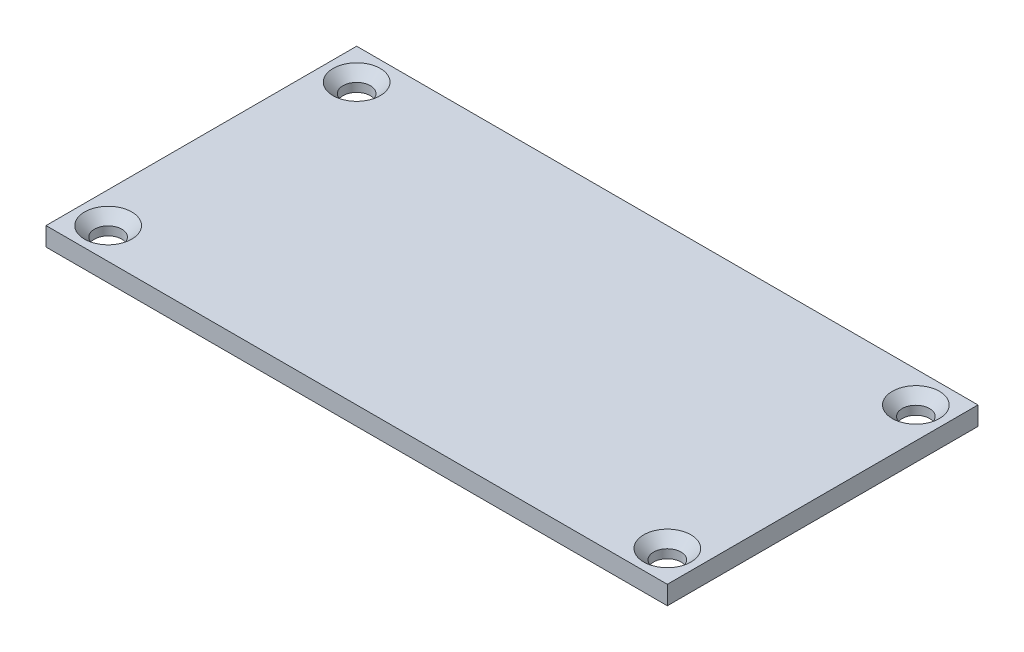
ISO-10303-21;
HEADER;
FILE_DESCRIPTION(('STEP AP214'),'2;1');
FILE_NAME('part.step','',(''),(''),'','','');
FILE_SCHEMA(('AUTOMOTIVE_DESIGN { 1 0 10303 214 1 1 1 1 }'));
ENDSEC;
DATA;
#1=APPLICATION_CONTEXT('core data for automotive mechanical design processes');
#2=APPLICATION_PROTOCOL_DEFINITION('international standard','automotive_design',2000,#1);
#3=PRODUCT_CONTEXT('',#1,'mechanical');
#4=PRODUCT('Part','Part','',(#3));
#5=PRODUCT_RELATED_PRODUCT_CATEGORY('part','',(#4));
#6=PRODUCT_DEFINITION_FORMATION('','',#4);
#7=PRODUCT_DEFINITION_CONTEXT('part definition',#1,'design');
#8=PRODUCT_DEFINITION('design','',#6,#7);
#9=PRODUCT_DEFINITION_SHAPE('','',#8);
#10=(LENGTH_UNIT() NAMED_UNIT(*) SI_UNIT(.MILLI.,.METRE.));
#11=(NAMED_UNIT(*) PLANE_ANGLE_UNIT() SI_UNIT($,.RADIAN.));
#12=(NAMED_UNIT(*) SI_UNIT($,.STERADIAN.) SOLID_ANGLE_UNIT());
#13=UNCERTAINTY_MEASURE_WITH_UNIT(LENGTH_MEASURE(1.E-05),#10,'distance_accuracy_value','');
#14=(GEOMETRIC_REPRESENTATION_CONTEXT(3) GLOBAL_UNCERTAINTY_ASSIGNED_CONTEXT((#13)) GLOBAL_UNIT_ASSIGNED_CONTEXT((#10,
#11,#12)) REPRESENTATION_CONTEXT('',''));
#15=CARTESIAN_POINT('',(0.,0.,0.));
#16=DIRECTION('',(0.,0.,1.));
#17=DIRECTION('',(1.,0.,0.));
#18=AXIS2_PLACEMENT_3D('',#15,#16,#17);
#19=CARTESIAN_POINT('',(47.5,1.5,-2.50000000000003));
#20=DIRECTION('',(0.,1.,0.));
#21=DIRECTION('',(0.,0.,1.));
#22=AXIS2_PLACEMENT_3D('',#19,#20,#21);
#23=CONICAL_SURFACE('',#22,1.9,0.785398163397449);
#24=CARTESIAN_POINT('',(47.5,0.700000000000001,-2.50000000000003));
#25=DIRECTION('',(0.,1.,0.));
#26=DIRECTION('',(0.,0.,1.));
#27=AXIS2_PLACEMENT_3D('',#24,#25,#26);
#28=CIRCLE('',#27,1.1);
#29=CARTESIAN_POINT('',(47.5,0.700000000000001,-1.40000000000003));
#30=VERTEX_POINT('',#29);
#31=EDGE_CURVE('E11',#30,#30,#28,.T.);
#32=ORIENTED_EDGE('',*,*,#31,.F.);
#33=EDGE_LOOP('',(#32));
#34=FACE_BOUND('',#33,.T.);
#35=CARTESIAN_POINT('',(47.5,1.5,-2.50000000000003));
#36=DIRECTION('',(0.,1.,0.));
#37=DIRECTION('',(0.,0.,1.));
#38=AXIS2_PLACEMENT_3D('',#35,#36,#37);
#39=CIRCLE('',#38,1.9);
#40=CARTESIAN_POINT('',(47.5,1.5,-0.600000000000027));
#41=VERTEX_POINT('',#40);
#42=EDGE_CURVE('E141',#41,#41,#39,.T.);
#43=ORIENTED_EDGE('',*,*,#42,.T.);
#44=EDGE_LOOP('',(#43));
#45=FACE_BOUND('',#44,.T.);
#46=ADVANCED_FACE('F39',(#34,#45),#23,.F.);
#47=CARTESIAN_POINT('',(47.5,1.5,-2.50000000000003));
#48=DIRECTION('',(0.,1.,0.));
#49=DIRECTION('',(0.,0.,1.));
#50=AXIS2_PLACEMENT_3D('',#47,#48,#49);
#51=CYLINDRICAL_SURFACE('',#50,1.1);
#52=CARTESIAN_POINT('',(47.5,0.,-2.50000000000003));
#53=DIRECTION('',(0.,1.,0.));
#54=DIRECTION('',(0.,0.,1.));
#55=AXIS2_PLACEMENT_3D('',#52,#53,#54);
#56=CIRCLE('',#55,1.1);
#57=CARTESIAN_POINT('',(47.5,0.,-1.40000000000003));
#58=VERTEX_POINT('',#57);
#59=EDGE_CURVE('E48',#58,#58,#56,.T.);
#60=ORIENTED_EDGE('',*,*,#59,.F.);
#61=EDGE_LOOP('',(#60));
#62=FACE_BOUND('',#61,.T.);
#63=ORIENTED_EDGE('',*,*,#31,.T.);
#64=EDGE_LOOP('',(#63));
#65=FACE_BOUND('',#64,.T.);
#66=ADVANCED_FACE('F150',(#62,#65),#51,.F.);
#67=CARTESIAN_POINT('',(2.49999999999999,1.5,-2.5));
#68=DIRECTION('',(0.,1.,0.));
#69=DIRECTION('',(0.,0.,1.));
#70=AXIS2_PLACEMENT_3D('',#67,#68,#69);
#71=CONICAL_SURFACE('',#70,1.9,0.785398163397449);
#72=CARTESIAN_POINT('',(2.49999999999999,0.700000000000001,-2.5));
#73=DIRECTION('',(0.,1.,0.));
#74=DIRECTION('',(0.,0.,1.));
#75=AXIS2_PLACEMENT_3D('',#72,#73,#74);
#76=CIRCLE('',#75,1.1);
#77=CARTESIAN_POINT('',(2.49999999999999,0.700000000000001,-1.4));
#78=VERTEX_POINT('',#77);
#79=EDGE_CURVE('E137',#78,#78,#76,.T.);
#80=ORIENTED_EDGE('',*,*,#79,.F.);
#81=EDGE_LOOP('',(#80));
#82=FACE_BOUND('',#81,.T.);
#83=CARTESIAN_POINT('',(2.49999999999999,1.5,-2.5));
#84=DIRECTION('',(0.,1.,0.));
#85=DIRECTION('',(0.,0.,1.));
#86=AXIS2_PLACEMENT_3D('',#83,#84,#85);
#87=CIRCLE('',#86,1.9);
#88=CARTESIAN_POINT('',(2.49999999999999,1.5,-0.600000000000002));
#89=VERTEX_POINT('',#88);
#90=EDGE_CURVE('E129',#89,#89,#87,.T.);
#91=ORIENTED_EDGE('',*,*,#90,.T.);
#92=EDGE_LOOP('',(#91));
#93=FACE_BOUND('',#92,.T.);
#94=ADVANCED_FACE('F153',(#82,#93),#71,.F.);
#95=CARTESIAN_POINT('',(2.49999999999999,1.5,-2.5));
#96=DIRECTION('',(0.,1.,0.));
#97=DIRECTION('',(0.,0.,1.));
#98=AXIS2_PLACEMENT_3D('',#95,#96,#97);
#99=CYLINDRICAL_SURFACE('',#98,1.1);
#100=CARTESIAN_POINT('',(2.49999999999999,0.,-2.5));
#101=DIRECTION('',(0.,1.,0.));
#102=DIRECTION('',(0.,0.,1.));
#103=AXIS2_PLACEMENT_3D('',#100,#101,#102);
#104=CIRCLE('',#103,1.1);
#105=CARTESIAN_POINT('',(2.49999999999999,0.,-1.4));
#106=VERTEX_POINT('',#105);
#107=EDGE_CURVE('E133',#106,#106,#104,.T.);
#108=ORIENTED_EDGE('',*,*,#107,.F.);
#109=EDGE_LOOP('',(#108));
#110=FACE_BOUND('',#109,.T.);
#111=ORIENTED_EDGE('',*,*,#79,.T.);
#112=EDGE_LOOP('',(#111));
#113=FACE_BOUND('',#112,.T.);
#114=ADVANCED_FACE('F184',(#110,#113),#99,.F.);
#115=CARTESIAN_POINT('',(0.,1.5,0.));
#116=DIRECTION('',(1.,0.,0.));
#117=DIRECTION('',(0.,0.,-1.));
#118=AXIS2_PLACEMENT_3D('',#115,#116,#117);
#119=PLANE('',#118);
#120=DIRECTION('',(0.,0.,1.));
#121=VECTOR('',#120,1.);
#122=CARTESIAN_POINT('',(0.,0.,0.));
#123=LINE('',#122,#121);
#124=CARTESIAN_POINT('',(0.,0.,-25.));
#125=VERTEX_POINT('',#124);
#126=CARTESIAN_POINT('',(0.,0.,0.));
#127=VERTEX_POINT('',#126);
#128=EDGE_CURVE('E112',#125,#127,#123,.T.);
#129=ORIENTED_EDGE('',*,*,#128,.T.);
#130=DIRECTION('',(0.,-1.,0.));
#131=VECTOR('',#130,1.);
#132=CARTESIAN_POINT('',(0.,1.5,0.));
#133=LINE('',#132,#131);
#134=CARTESIAN_POINT('',(0.,1.5,0.));
#135=VERTEX_POINT('',#134);
#136=EDGE_CURVE('E101',#135,#127,#133,.T.);
#137=ORIENTED_EDGE('',*,*,#136,.F.);
#138=DIRECTION('',(0.,0.,1.));
#139=VECTOR('',#138,1.);
#140=CARTESIAN_POINT('',(0.,1.5,0.));
#141=LINE('',#140,#139);
#142=CARTESIAN_POINT('',(0.,1.5,-25.));
#143=VERTEX_POINT('',#142);
#144=EDGE_CURVE('E93',#143,#135,#141,.T.);
#145=ORIENTED_EDGE('',*,*,#144,.F.);
#146=DIRECTION('',(0.,-1.,0.));
#147=VECTOR('',#146,1.);
#148=CARTESIAN_POINT('',(0.,1.5,-25.));
#149=LINE('',#148,#147);
#150=EDGE_CURVE('E108',#143,#125,#149,.T.);
#151=ORIENTED_EDGE('',*,*,#150,.T.);
#152=EDGE_LOOP('',(#129,#137,#145,#151));
#153=FACE_BOUND('',#152,.T.);
#154=ADVANCED_FACE('F181',(#153),#119,.F.);
#155=CARTESIAN_POINT('',(0.,1.5,0.));
#156=DIRECTION('',(0.,0.,-1.));
#157=DIRECTION('',(-1.,0.,0.));
#158=AXIS2_PLACEMENT_3D('',#155,#156,#157);
#159=PLANE('',#158);
#160=DIRECTION('',(1.,0.,0.));
#161=VECTOR('',#160,1.);
#162=CARTESIAN_POINT('',(0.,0.,0.));
#163=LINE('',#162,#161);
#164=CARTESIAN_POINT('',(50.,0.,0.));
#165=VERTEX_POINT('',#164);
#166=EDGE_CURVE('E99',#127,#165,#163,.T.);
#167=ORIENTED_EDGE('',*,*,#166,.T.);
#168=DIRECTION('',(0.,-1.,0.));
#169=VECTOR('',#168,1.);
#170=CARTESIAN_POINT('',(50.,1.5,0.));
#171=LINE('',#170,#169);
#172=CARTESIAN_POINT('',(50.,1.5,0.));
#173=VERTEX_POINT('',#172);
#174=EDGE_CURVE('E97',#173,#165,#171,.T.);
#175=ORIENTED_EDGE('',*,*,#174,.F.);
#176=DIRECTION('',(1.,0.,0.));
#177=VECTOR('',#176,1.);
#178=CARTESIAN_POINT('',(0.,1.5,0.));
#179=LINE('',#178,#177);
#180=EDGE_CURVE('E87',#135,#173,#179,.T.);
#181=ORIENTED_EDGE('',*,*,#180,.F.);
#182=ORIENTED_EDGE('',*,*,#136,.T.);
#183=EDGE_LOOP('',(#167,#175,#181,#182));
#184=FACE_BOUND('',#183,.T.);
#185=ADVANCED_FACE('F98',(#184),#159,.F.);
#186=CARTESIAN_POINT('',(50.,1.5,0.));
#187=DIRECTION('',(-1.,0.,0.));
#188=DIRECTION('',(0.,0.,1.));
#189=AXIS2_PLACEMENT_3D('',#186,#187,#188);
#190=PLANE('',#189);
#191=DIRECTION('',(0.,0.,-1.));
#192=VECTOR('',#191,1.);
#193=CARTESIAN_POINT('',(50.,0.,0.));
#194=LINE('',#193,#192);
#195=CARTESIAN_POINT('',(50.,0.,-25.));
#196=VERTEX_POINT('',#195);
#197=EDGE_CURVE('E73',#165,#196,#194,.T.);
#198=ORIENTED_EDGE('',*,*,#197,.T.);
#199=DIRECTION('',(0.,-1.,0.));
#200=VECTOR('',#199,1.);
#201=CARTESIAN_POINT('',(50.,1.5,-25.));
#202=LINE('',#201,#200);
#203=CARTESIAN_POINT('',(50.,1.5,-25.));
#204=VERTEX_POINT('',#203);
#205=EDGE_CURVE('E102',#204,#196,#202,.T.);
#206=ORIENTED_EDGE('',*,*,#205,.F.);
#207=DIRECTION('',(0.,0.,-1.));
#208=VECTOR('',#207,1.);
#209=CARTESIAN_POINT('',(50.,1.5,0.));
#210=LINE('',#209,#208);
#211=EDGE_CURVE('E91',#173,#204,#210,.T.);
#212=ORIENTED_EDGE('',*,*,#211,.F.);
#213=ORIENTED_EDGE('',*,*,#174,.T.);
#214=EDGE_LOOP('',(#198,#206,#212,#213));
#215=FACE_BOUND('',#214,.T.);
#216=ADVANCED_FACE('F104',(#215),#190,.F.);
#217=CARTESIAN_POINT('',(0.,1.5,-25.));
#218=DIRECTION('',(0.,0.,1.));
#219=DIRECTION('',(1.,0.,0.));
#220=AXIS2_PLACEMENT_3D('',#217,#218,#219);
#221=PLANE('',#220);
#222=DIRECTION('',(-1.,0.,0.));
#223=VECTOR('',#222,1.);
#224=CARTESIAN_POINT('',(0.,0.,-25.));
#225=LINE('',#224,#223);
#226=EDGE_CURVE('E79',#196,#125,#225,.T.);
#227=ORIENTED_EDGE('',*,*,#226,.T.);
#228=ORIENTED_EDGE('',*,*,#150,.F.);
#229=DIRECTION('',(-1.,0.,0.));
#230=VECTOR('',#229,1.);
#231=CARTESIAN_POINT('',(0.,1.5,-25.));
#232=LINE('',#231,#230);
#233=EDGE_CURVE('E56',#204,#143,#232,.T.);
#234=ORIENTED_EDGE('',*,*,#233,.F.);
#235=ORIENTED_EDGE('',*,*,#205,.T.);
#236=EDGE_LOOP('',(#227,#228,#234,#235));
#237=FACE_BOUND('',#236,.T.);
#238=ADVANCED_FACE('F161',(#237),#221,.F.);
#239=CARTESIAN_POINT('',(0.,1.5,0.));
#240=DIRECTION('',(0.,-1.,0.));
#241=DIRECTION('',(0.,0.,-1.));
#242=AXIS2_PLACEMENT_3D('',#239,#240,#241);
#243=PLANE('',#242);
#244=CARTESIAN_POINT('',(47.5,1.5,-22.5));
#245=DIRECTION('',(0.,1.,0.));
#246=DIRECTION('',(0.,0.,1.));
#247=AXIS2_PLACEMENT_3D('',#244,#245,#246);
#248=CIRCLE('',#247,1.9);
#249=CARTESIAN_POINT('',(47.5,1.5,-20.6));
#250=VERTEX_POINT('',#249);
#251=EDGE_CURVE('E282',#250,#250,#248,.T.);
#252=ORIENTED_EDGE('',*,*,#251,.F.);
#253=EDGE_LOOP('',(#252));
#254=FACE_BOUND('',#253,.T.);
#255=CARTESIAN_POINT('',(2.49999999999999,1.5,-22.5));
#256=DIRECTION('',(0.,1.,0.));
#257=DIRECTION('',(0.,0.,1.));
#258=AXIS2_PLACEMENT_3D('',#255,#256,#257);
#259=CIRCLE('',#258,1.9);
#260=CARTESIAN_POINT('',(2.49999999999999,1.5,-20.6));
#261=VERTEX_POINT('',#260);
#262=EDGE_CURVE('E292',#261,#261,#259,.T.);
#263=ORIENTED_EDGE('',*,*,#262,.F.);
#264=EDGE_LOOP('',(#263));
#265=FACE_BOUND('',#264,.T.);
#266=ORIENTED_EDGE('',*,*,#144,.T.);
#267=ORIENTED_EDGE('',*,*,#180,.T.);
#268=ORIENTED_EDGE('',*,*,#211,.T.);
#269=ORIENTED_EDGE('',*,*,#233,.T.);
#270=EDGE_LOOP('',(#266,#267,#268,#269));
#271=FACE_BOUND('',#270,.T.);
#272=ORIENTED_EDGE('',*,*,#90,.F.);
#273=EDGE_LOOP('',(#272));
#274=FACE_BOUND('',#273,.T.);
#275=ORIENTED_EDGE('',*,*,#42,.F.);
#276=EDGE_LOOP('',(#275));
#277=FACE_BOUND('',#276,.T.);
#278=ADVANCED_FACE('F88',(#254,#265,#271,#274,#277),#243,.F.);
#279=CARTESIAN_POINT('',(0.,0.,0.));
#280=DIRECTION('',(0.,-1.,0.));
#281=DIRECTION('',(0.,0.,-1.));
#282=AXIS2_PLACEMENT_3D('',#279,#280,#281);
#283=PLANE('',#282);
#284=CARTESIAN_POINT('',(47.5,0.,-22.5));
#285=DIRECTION('',(0.,1.,0.));
#286=DIRECTION('',(0.,0.,1.));
#287=AXIS2_PLACEMENT_3D('',#284,#285,#286);
#288=CIRCLE('',#287,1.1);
#289=CARTESIAN_POINT('',(47.5,0.,-21.4));
#290=VERTEX_POINT('',#289);
#291=EDGE_CURVE('E284',#290,#290,#288,.T.);
#292=ORIENTED_EDGE('',*,*,#291,.T.);
#293=EDGE_LOOP('',(#292));
#294=FACE_BOUND('',#293,.T.);
#295=CARTESIAN_POINT('',(2.49999999999999,0.,-22.5));
#296=DIRECTION('',(0.,1.,0.));
#297=DIRECTION('',(0.,0.,1.));
#298=AXIS2_PLACEMENT_3D('',#295,#296,#297);
#299=CIRCLE('',#298,1.1);
#300=CARTESIAN_POINT('',(2.49999999999999,0.,-21.4));
#301=VERTEX_POINT('',#300);
#302=EDGE_CURVE('E116',#301,#301,#299,.T.);
#303=ORIENTED_EDGE('',*,*,#302,.T.);
#304=EDGE_LOOP('',(#303));
#305=FACE_BOUND('',#304,.T.);
#306=ORIENTED_EDGE('',*,*,#128,.F.);
#307=ORIENTED_EDGE('',*,*,#226,.F.);
#308=ORIENTED_EDGE('',*,*,#197,.F.);
#309=ORIENTED_EDGE('',*,*,#166,.F.);
#310=EDGE_LOOP('',(#306,#307,#308,#309));
#311=FACE_BOUND('',#310,.T.);
#312=ORIENTED_EDGE('',*,*,#107,.T.);
#313=EDGE_LOOP('',(#312));
#314=FACE_BOUND('',#313,.T.);
#315=ORIENTED_EDGE('',*,*,#59,.T.);
#316=EDGE_LOOP('',(#315));
#317=FACE_BOUND('',#316,.T.);
#318=ADVANCED_FACE('F148',(#294,#305,#311,#314,#317),#283,.T.);
#319=CARTESIAN_POINT('',(2.49999999999999,1.5,-22.5));
#320=DIRECTION('',(0.,1.,0.));
#321=DIRECTION('',(0.,0.,1.));
#322=AXIS2_PLACEMENT_3D('',#319,#320,#321);
#323=CYLINDRICAL_SURFACE('',#322,1.1);
#324=ORIENTED_EDGE('',*,*,#302,.F.);
#325=EDGE_LOOP('',(#324));
#326=FACE_BOUND('',#325,.T.);
#327=CARTESIAN_POINT('',(2.49999999999999,0.700000000000001,-22.5));
#328=DIRECTION('',(0.,1.,0.));
#329=DIRECTION('',(0.,0.,1.));
#330=AXIS2_PLACEMENT_3D('',#327,#328,#329);
#331=CIRCLE('',#330,1.1);
#332=CARTESIAN_POINT('',(2.49999999999999,0.700000000000001,-21.4));
#333=VERTEX_POINT('',#332);
#334=EDGE_CURVE('E296',#333,#333,#331,.T.);
#335=ORIENTED_EDGE('',*,*,#334,.T.);
#336=EDGE_LOOP('',(#335));
#337=FACE_BOUND('',#336,.T.);
#338=ADVANCED_FACE('F168',(#326,#337),#323,.F.);
#339=CARTESIAN_POINT('',(2.49999999999999,1.5,-22.5));
#340=DIRECTION('',(0.,1.,0.));
#341=DIRECTION('',(0.,0.,1.));
#342=AXIS2_PLACEMENT_3D('',#339,#340,#341);
#343=CONICAL_SURFACE('',#342,1.9,0.785398163397449);
#344=ORIENTED_EDGE('',*,*,#334,.F.);
#345=EDGE_LOOP('',(#344));
#346=FACE_BOUND('',#345,.T.);
#347=ORIENTED_EDGE('',*,*,#262,.T.);
#348=EDGE_LOOP('',(#347));
#349=FACE_BOUND('',#348,.T.);
#350=ADVANCED_FACE('F229',(#346,#349),#343,.F.);
#351=CARTESIAN_POINT('',(47.5,1.5,-22.5));
#352=DIRECTION('',(0.,1.,0.));
#353=DIRECTION('',(0.,0.,1.));
#354=AXIS2_PLACEMENT_3D('',#351,#352,#353);
#355=CYLINDRICAL_SURFACE('',#354,1.1);
#356=ORIENTED_EDGE('',*,*,#291,.F.);
#357=EDGE_LOOP('',(#356));
#358=FACE_BOUND('',#357,.T.);
#359=CARTESIAN_POINT('',(47.5,0.700000000000001,-22.5));
#360=DIRECTION('',(0.,1.,0.));
#361=DIRECTION('',(0.,0.,1.));
#362=AXIS2_PLACEMENT_3D('',#359,#360,#361);
#363=CIRCLE('',#362,1.1);
#364=CARTESIAN_POINT('',(47.5,0.700000000000001,-21.4));
#365=VERTEX_POINT('',#364);
#366=EDGE_CURVE('E280',#365,#365,#363,.T.);
#367=ORIENTED_EDGE('',*,*,#366,.T.);
#368=EDGE_LOOP('',(#367));
#369=FACE_BOUND('',#368,.T.);
#370=ADVANCED_FACE('F239',(#358,#369),#355,.F.);
#371=CARTESIAN_POINT('',(47.5,1.5,-22.5));
#372=DIRECTION('',(0.,1.,0.));
#373=DIRECTION('',(0.,0.,1.));
#374=AXIS2_PLACEMENT_3D('',#371,#372,#373);
#375=CONICAL_SURFACE('',#374,1.9,0.785398163397449);
#376=ORIENTED_EDGE('',*,*,#366,.F.);
#377=EDGE_LOOP('',(#376));
#378=FACE_BOUND('',#377,.T.);
#379=ORIENTED_EDGE('',*,*,#251,.T.);
#380=EDGE_LOOP('',(#379));
#381=FACE_BOUND('',#380,.T.);
#382=ADVANCED_FACE('F263',(#378,#381),#375,.F.);
#383=CLOSED_SHELL('',(#46,#66,#94,#114,#154,#185,#216,#238,#278,#318,#338,#350,#370,#382));
#384=MANIFOLD_SOLID_BREP('B2',#383);
#385=ADVANCED_BREP_SHAPE_REPRESENTATION('',(#18,#384),#14);
#386=SHAPE_DEFINITION_REPRESENTATION(#9,#385);
ENDSEC;
END-ISO-10303-21;
